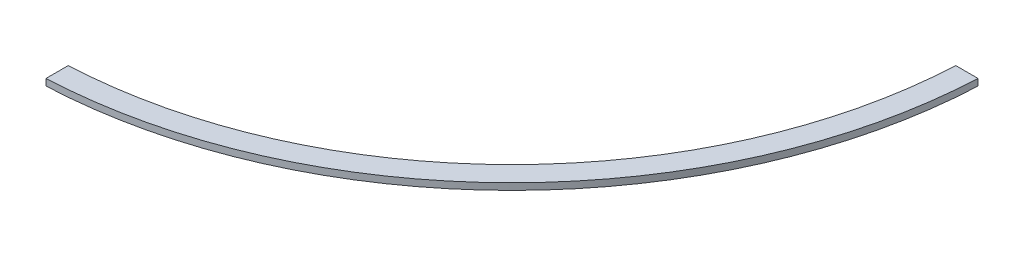
ISO-10303-21;
HEADER;
FILE_DESCRIPTION(('STEP AP214'),'2;1');
FILE_NAME('part.step','',(''),(''),'','','');
FILE_SCHEMA(('AUTOMOTIVE_DESIGN { 1 0 10303 214 1 1 1 1 }'));
ENDSEC;
DATA;
#1=APPLICATION_CONTEXT('core data for automotive mechanical design processes');
#2=APPLICATION_PROTOCOL_DEFINITION('international standard','automotive_design',2000,#1);
#3=PRODUCT_CONTEXT('',#1,'mechanical');
#4=PRODUCT('Part','Part','',(#3));
#5=PRODUCT_RELATED_PRODUCT_CATEGORY('part','',(#4));
#6=PRODUCT_DEFINITION_FORMATION('','',#4);
#7=PRODUCT_DEFINITION_CONTEXT('part definition',#1,'design');
#8=PRODUCT_DEFINITION('design','',#6,#7);
#9=PRODUCT_DEFINITION_SHAPE('','',#8);
#10=(LENGTH_UNIT() NAMED_UNIT(*) SI_UNIT(.MILLI.,.METRE.));
#11=(NAMED_UNIT(*) PLANE_ANGLE_UNIT() SI_UNIT($,.RADIAN.));
#12=(NAMED_UNIT(*) SI_UNIT($,.STERADIAN.) SOLID_ANGLE_UNIT());
#13=UNCERTAINTY_MEASURE_WITH_UNIT(LENGTH_MEASURE(1.E-05),#10,'distance_accuracy_value','');
#14=(GEOMETRIC_REPRESENTATION_CONTEXT(3) GLOBAL_UNCERTAINTY_ASSIGNED_CONTEXT((#13)) GLOBAL_UNIT_ASSIGNED_CONTEXT((#10,
#11,#12)) REPRESENTATION_CONTEXT('',''));
#15=CARTESIAN_POINT('',(0.,0.,0.));
#16=DIRECTION('',(0.,0.,1.));
#17=DIRECTION('',(1.,0.,0.));
#18=AXIS2_PLACEMENT_3D('',#15,#16,#17);
#19=CARTESIAN_POINT('',(0.,1.5,0.));
#20=DIRECTION('',(0.,-1.,0.));
#21=DIRECTION('',(0.,0.,-1.));
#22=AXIS2_PLACEMENT_3D('',#19,#20,#21);
#23=CYLINDRICAL_SURFACE('',#22,210.);
#24=CARTESIAN_POINT('',(0.,1.5,0.));
#25=DIRECTION('',(0.,1.,0.));
#26=DIRECTION('',(0.,0.,1.));
#27=AXIS2_PLACEMENT_3D('',#24,#25,#26);
#28=CIRCLE('',#27,210.);
#29=CARTESIAN_POINT('',(10.,1.5,209.76176963403));
#30=VERTEX_POINT('',#29);
#31=CARTESIAN_POINT('',(209.76176963403,1.5,10.));
#32=VERTEX_POINT('',#31);
#33=EDGE_CURVE('E135',#30,#32,#28,.T.);
#34=ORIENTED_EDGE('',*,*,#33,.T.);
#35=DIRECTION('',(0.,-1.,0.));
#36=VECTOR('',#35,1.);
#37=CARTESIAN_POINT('',(209.76176963403,1.5,10.));
#38=LINE('',#37,#36);
#39=CARTESIAN_POINT('',(209.76176963403,-1.5,10.));
#40=VERTEX_POINT('',#39);
#41=EDGE_CURVE('E125',#32,#40,#38,.T.);
#42=ORIENTED_EDGE('',*,*,#41,.T.);
#43=CARTESIAN_POINT('',(0.,-1.5,0.));
#44=DIRECTION('',(0.,1.,0.));
#45=DIRECTION('',(0.,0.,1.));
#46=AXIS2_PLACEMENT_3D('',#43,#44,#45);
#47=CIRCLE('',#46,210.);
#48=CARTESIAN_POINT('',(10.,-1.5,209.76176963403));
#49=VERTEX_POINT('',#48);
#50=EDGE_CURVE('E133',#49,#40,#47,.T.);
#51=ORIENTED_EDGE('',*,*,#50,.F.);
#52=DIRECTION('',(0.,-1.,0.));
#53=VECTOR('',#52,1.);
#54=CARTESIAN_POINT('',(10.,1.5,209.76176963403));
#55=LINE('',#54,#53);
#56=EDGE_CURVE('E119',#49,#30,#55,.F.);
#57=ORIENTED_EDGE('',*,*,#56,.T.);
#58=EDGE_LOOP('',(#34,#42,#51,#57));
#59=FACE_BOUND('',#58,.T.);
#60=ADVANCED_FACE('F80',(#59),#23,.F.);
#61=CARTESIAN_POINT('',(0.,1.5,0.));
#62=DIRECTION('',(0.,-1.,0.));
#63=DIRECTION('',(0.,0.,-1.));
#64=AXIS2_PLACEMENT_3D('',#61,#62,#63);
#65=CYLINDRICAL_SURFACE('',#64,220.);
#66=DIRECTION('',(0.,-1.,0.));
#67=VECTOR('',#66,1.);
#68=CARTESIAN_POINT('',(219.772609758359,1.5,10.));
#69=LINE('',#68,#67);
#70=CARTESIAN_POINT('',(219.772609758359,1.5,10.));
#71=VERTEX_POINT('',#70);
#72=CARTESIAN_POINT('',(219.772609758359,-1.5,10.));
#73=VERTEX_POINT('',#72);
#74=EDGE_CURVE('E90',#71,#73,#69,.T.);
#75=ORIENTED_EDGE('',*,*,#74,.F.);
#76=CARTESIAN_POINT('',(0.,1.5,0.));
#77=DIRECTION('',(0.,1.,0.));
#78=DIRECTION('',(0.,0.,1.));
#79=AXIS2_PLACEMENT_3D('',#76,#77,#78);
#80=CIRCLE('',#79,220.);
#81=CARTESIAN_POINT('',(10.,1.5,219.772609758359));
#82=VERTEX_POINT('',#81);
#83=EDGE_CURVE('E138',#82,#71,#80,.T.);
#84=ORIENTED_EDGE('',*,*,#83,.F.);
#85=DIRECTION('',(0.,-1.,0.));
#86=VECTOR('',#85,1.);
#87=CARTESIAN_POINT('',(10.,1.5,219.772609758359));
#88=LINE('',#87,#86);
#89=CARTESIAN_POINT('',(10.,-1.5,219.772609758359));
#90=VERTEX_POINT('',#89);
#91=EDGE_CURVE('E145',#90,#82,#88,.F.);
#92=ORIENTED_EDGE('',*,*,#91,.F.);
#93=CARTESIAN_POINT('',(0.,-1.5,0.));
#94=DIRECTION('',(0.,1.,0.));
#95=DIRECTION('',(0.,0.,1.));
#96=AXIS2_PLACEMENT_3D('',#93,#94,#95);
#97=CIRCLE('',#96,220.);
#98=EDGE_CURVE('E84',#90,#73,#97,.T.);
#99=ORIENTED_EDGE('',*,*,#98,.T.);
#100=EDGE_LOOP('',(#75,#84,#92,#99));
#101=FACE_BOUND('',#100,.T.);
#102=ADVANCED_FACE('F151',(#101),#65,.T.);
#103=CARTESIAN_POINT('',(0.,-1.5,0.));
#104=DIRECTION('',(0.,1.,0.));
#105=DIRECTION('',(0.,0.,1.));
#106=AXIS2_PLACEMENT_3D('',#103,#104,#105);
#107=PLANE('',#106);
#108=DIRECTION('',(-1.,0.,0.));
#109=VECTOR('',#108,1.);
#110=CARTESIAN_POINT('',(220.,-1.5,10.));
#111=LINE('',#110,#109);
#112=EDGE_CURVE('E12',#73,#40,#111,.T.);
#113=ORIENTED_EDGE('',*,*,#112,.F.);
#114=ORIENTED_EDGE('',*,*,#98,.F.);
#115=DIRECTION('',(0.,0.,1.));
#116=VECTOR('',#115,1.);
#117=CARTESIAN_POINT('',(10.,-1.5,-220.));
#118=LINE('',#117,#116);
#119=EDGE_CURVE('E115',#49,#90,#118,.T.);
#120=ORIENTED_EDGE('',*,*,#119,.F.);
#121=ORIENTED_EDGE('',*,*,#50,.T.);
#122=EDGE_LOOP('',(#113,#114,#120,#121));
#123=FACE_BOUND('',#122,.T.);
#124=ADVANCED_FACE('F137',(#123),#107,.F.);
#125=CARTESIAN_POINT('',(0.,1.5,0.));
#126=DIRECTION('',(0.,1.,0.));
#127=DIRECTION('',(0.,0.,1.));
#128=AXIS2_PLACEMENT_3D('',#125,#126,#127);
#129=PLANE('',#128);
#130=ORIENTED_EDGE('',*,*,#83,.T.);
#131=DIRECTION('',(-1.,0.,0.));
#132=VECTOR('',#131,1.);
#133=CARTESIAN_POINT('',(220.,1.5,10.));
#134=LINE('',#133,#132);
#135=EDGE_CURVE('E99',#71,#32,#134,.T.);
#136=ORIENTED_EDGE('',*,*,#135,.T.);
#137=ORIENTED_EDGE('',*,*,#33,.F.);
#138=DIRECTION('',(0.,0.,1.));
#139=VECTOR('',#138,1.);
#140=CARTESIAN_POINT('',(10.,1.5,-220.));
#141=LINE('',#140,#139);
#142=EDGE_CURVE('E121',#30,#82,#141,.T.);
#143=ORIENTED_EDGE('',*,*,#142,.T.);
#144=EDGE_LOOP('',(#130,#136,#137,#143));
#145=FACE_BOUND('',#144,.T.);
#146=ADVANCED_FACE('F148',(#145),#129,.T.);
#147=CARTESIAN_POINT('',(10.,-1.5,-220.));
#148=DIRECTION('',(-1.,0.,0.));
#149=DIRECTION('',(0.,0.,1.));
#150=AXIS2_PLACEMENT_3D('',#147,#148,#149);
#151=PLANE('',#150);
#152=ORIENTED_EDGE('',*,*,#91,.T.);
#153=ORIENTED_EDGE('',*,*,#142,.F.);
#154=ORIENTED_EDGE('',*,*,#56,.F.);
#155=ORIENTED_EDGE('',*,*,#119,.T.);
#156=EDGE_LOOP('',(#152,#153,#154,#155));
#157=FACE_BOUND('',#156,.T.);
#158=ADVANCED_FACE('F154',(#157),#151,.T.);
#159=CARTESIAN_POINT('',(220.,-1.5,10.));
#160=DIRECTION('',(0.,0.,-1.));
#161=DIRECTION('',(-1.,0.,0.));
#162=AXIS2_PLACEMENT_3D('',#159,#160,#161);
#163=PLANE('',#162);
#164=ORIENTED_EDGE('',*,*,#74,.T.);
#165=ORIENTED_EDGE('',*,*,#112,.T.);
#166=ORIENTED_EDGE('',*,*,#41,.F.);
#167=ORIENTED_EDGE('',*,*,#135,.F.);
#168=EDGE_LOOP('',(#164,#165,#166,#167));
#169=FACE_BOUND('',#168,.T.);
#170=ADVANCED_FACE('F82',(#169),#163,.T.);
#171=CLOSED_SHELL('',(#60,#102,#124,#146,#158,#170));
#172=MANIFOLD_SOLID_BREP('B2',#171);
#173=ADVANCED_BREP_SHAPE_REPRESENTATION('',(#18,#172),#14);
#174=SHAPE_DEFINITION_REPRESENTATION(#9,#173);
ENDSEC;
END-ISO-10303-21;
